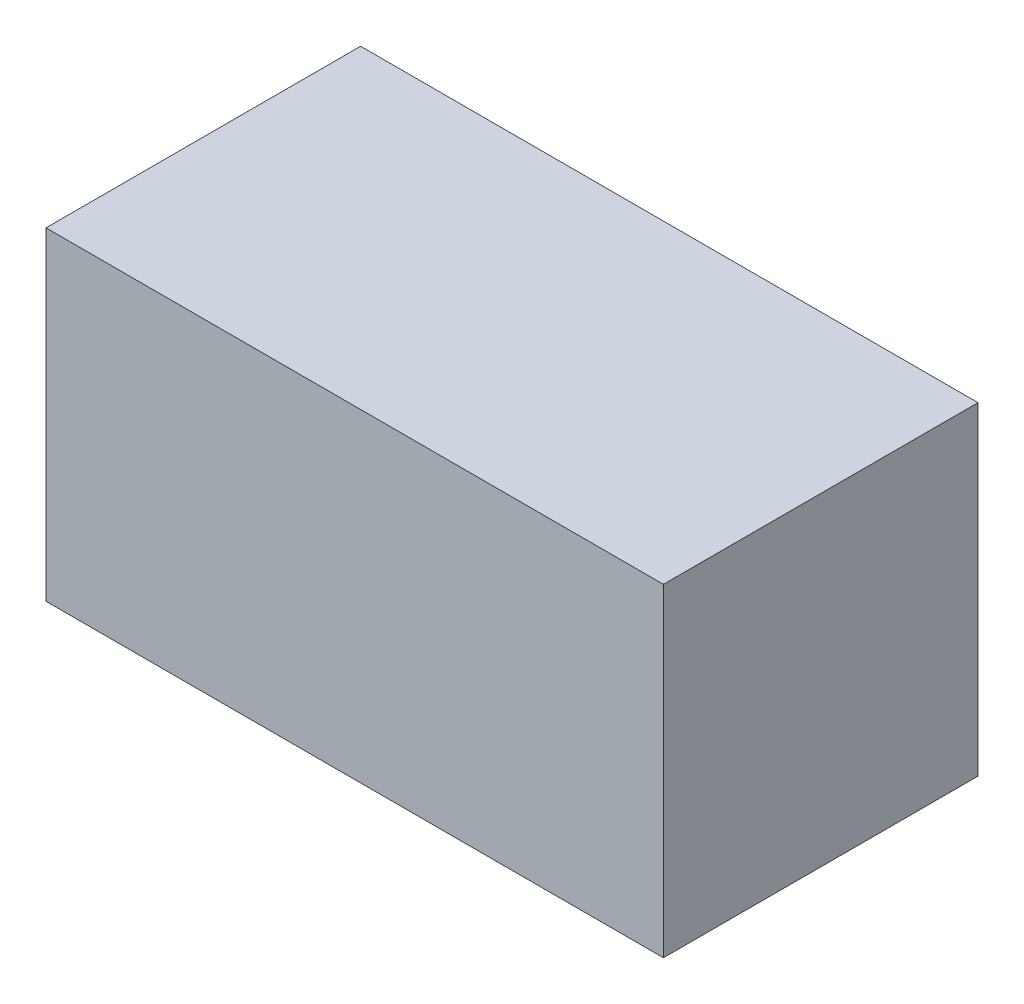
ISO-10303-21;
HEADER;
FILE_DESCRIPTION(('STEP AP214'),'2;1');
FILE_NAME('part.step','',(''),(''),'','','');
FILE_SCHEMA(('AUTOMOTIVE_DESIGN { 1 0 10303 214 1 1 1 1 }'));
ENDSEC;
DATA;
#1=APPLICATION_CONTEXT('core data for automotive mechanical design processes');
#2=APPLICATION_PROTOCOL_DEFINITION('international standard','automotive_design',2000,#1);
#3=PRODUCT_CONTEXT('',#1,'mechanical');
#4=PRODUCT('Part','Part','',(#3));
#5=PRODUCT_RELATED_PRODUCT_CATEGORY('part','',(#4));
#6=PRODUCT_DEFINITION_FORMATION('','',#4);
#7=PRODUCT_DEFINITION_CONTEXT('part definition',#1,'design');
#8=PRODUCT_DEFINITION('design','',#6,#7);
#9=PRODUCT_DEFINITION_SHAPE('','',#8);
#10=(LENGTH_UNIT() NAMED_UNIT(*) SI_UNIT(.MILLI.,.METRE.));
#11=(NAMED_UNIT(*) PLANE_ANGLE_UNIT() SI_UNIT($,.RADIAN.));
#12=(NAMED_UNIT(*) SI_UNIT($,.STERADIAN.) SOLID_ANGLE_UNIT());
#13=UNCERTAINTY_MEASURE_WITH_UNIT(LENGTH_MEASURE(1.E-05),#10,'distance_accuracy_value','');
#14=(GEOMETRIC_REPRESENTATION_CONTEXT(3) GLOBAL_UNCERTAINTY_ASSIGNED_CONTEXT((#13)) GLOBAL_UNIT_ASSIGNED_CONTEXT((#10,
#11,#12)) REPRESENTATION_CONTEXT('',''));
#15=CARTESIAN_POINT('',(0.,0.,0.));
#16=DIRECTION('',(0.,0.,1.));
#17=DIRECTION('',(1.,0.,0.));
#18=AXIS2_PLACEMENT_3D('',#15,#16,#17);
#19=CARTESIAN_POINT('',(-10.49999932,-5.49999916,10.69999892));
#20=DIRECTION('',(0.,0.,-1.));
#21=DIRECTION('',(-1.,0.,0.));
#22=AXIS2_PLACEMENT_3D('',#19,#20,#21);
#23=PLANE('',#22);
#24=DIRECTION('',(0.,1.,0.));
#25=VECTOR('',#24,1.);
#26=CARTESIAN_POINT('',(10.49999932,-5.49999916,10.69999892));
#27=LINE('',#26,#25);
#28=CARTESIAN_POINT('',(10.49999932,-5.49999916,10.69999892));
#29=VERTEX_POINT('',#28);
#30=CARTESIAN_POINT('',(10.49999932,5.49999916,10.69999892));
#31=VERTEX_POINT('',#30);
#32=EDGE_CURVE('E55',#29,#31,#27,.T.);
#33=ORIENTED_EDGE('',*,*,#32,.T.);
#34=DIRECTION('',(1.,0.,0.));
#35=VECTOR('',#34,1.);
#36=CARTESIAN_POINT('',(10.49999932,5.49999916,10.69999892));
#37=LINE('',#36,#35);
#38=CARTESIAN_POINT('',(-10.49999932,5.49999916,10.69999892));
#39=VERTEX_POINT('',#38);
#40=EDGE_CURVE('E57',#31,#39,#37,.F.);
#41=ORIENTED_EDGE('',*,*,#40,.T.);
#42=DIRECTION('',(0.,1.,0.));
#43=VECTOR('',#42,1.);
#44=CARTESIAN_POINT('',(-10.49999932,5.49999916,10.69999892));
#45=LINE('',#44,#43);
#46=CARTESIAN_POINT('',(-10.49999932,-5.49999916,10.69999892));
#47=VERTEX_POINT('',#46);
#48=EDGE_CURVE('E20',#39,#47,#45,.F.);
#49=ORIENTED_EDGE('',*,*,#48,.T.);
#50=DIRECTION('',(1.,0.,0.));
#51=VECTOR('',#50,1.);
#52=CARTESIAN_POINT('',(-10.49999932,-5.49999916,10.69999892));
#53=LINE('',#52,#51);
#54=EDGE_CURVE('E80',#47,#29,#53,.T.);
#55=ORIENTED_EDGE('',*,*,#54,.T.);
#56=EDGE_LOOP('',(#33,#41,#49,#55));
#57=FACE_BOUND('',#56,.T.);
#58=ADVANCED_FACE('F17',(#57),#23,.F.);
#59=CARTESIAN_POINT('',(-10.49999932,5.49999916,0.));
#60=DIRECTION('',(1.,0.,0.));
#61=DIRECTION('',(0.,0.,-1.));
#62=AXIS2_PLACEMENT_3D('',#59,#60,#61);
#63=PLANE('',#62);
#64=DIRECTION('',(0.,0.,1.));
#65=VECTOR('',#64,1.);
#66=CARTESIAN_POINT('',(-10.49999932,-5.49999916,0.));
#67=LINE('',#66,#65);
#68=CARTESIAN_POINT('',(-10.49999932,-5.49999916,0.));
#69=VERTEX_POINT('',#68);
#70=EDGE_CURVE('E68',#69,#47,#67,.T.);
#71=ORIENTED_EDGE('',*,*,#70,.T.);
#72=ORIENTED_EDGE('',*,*,#48,.F.);
#73=DIRECTION('',(0.,0.,-1.));
#74=VECTOR('',#73,1.);
#75=CARTESIAN_POINT('',(-10.49999932,5.49999916,0.));
#76=LINE('',#75,#74);
#77=CARTESIAN_POINT('',(-10.49999932,5.49999916,0.));
#78=VERTEX_POINT('',#77);
#79=EDGE_CURVE('E63',#39,#78,#76,.T.);
#80=ORIENTED_EDGE('',*,*,#79,.T.);
#81=DIRECTION('',(0.,1.,0.));
#82=VECTOR('',#81,1.);
#83=CARTESIAN_POINT('',(-10.49999932,-5.49999916,0.));
#84=LINE('',#83,#82);
#85=EDGE_CURVE('E83',#69,#78,#84,.T.);
#86=ORIENTED_EDGE('',*,*,#85,.F.);
#87=EDGE_LOOP('',(#71,#72,#80,#86));
#88=FACE_BOUND('',#87,.T.);
#89=ADVANCED_FACE('F65',(#88),#63,.F.);
#90=CARTESIAN_POINT('',(10.49999932,5.49999916,0.));
#91=DIRECTION('',(0.,-1.,0.));
#92=DIRECTION('',(0.,0.,-1.));
#93=AXIS2_PLACEMENT_3D('',#90,#91,#92);
#94=PLANE('',#93);
#95=ORIENTED_EDGE('',*,*,#79,.F.);
#96=ORIENTED_EDGE('',*,*,#40,.F.);
#97=DIRECTION('',(0.,0.,1.));
#98=VECTOR('',#97,1.);
#99=CARTESIAN_POINT('',(10.49999932,5.49999916,0.));
#100=LINE('',#99,#98);
#101=CARTESIAN_POINT('',(10.49999932,5.49999916,0.));
#102=VERTEX_POINT('',#101);
#103=EDGE_CURVE('E75',#31,#102,#100,.F.);
#104=ORIENTED_EDGE('',*,*,#103,.T.);
#105=DIRECTION('',(-1.,0.,0.));
#106=VECTOR('',#105,1.);
#107=CARTESIAN_POINT('',(-10.49999932,5.49999916,0.));
#108=LINE('',#107,#106);
#109=EDGE_CURVE('E72',#78,#102,#108,.F.);
#110=ORIENTED_EDGE('',*,*,#109,.F.);
#111=EDGE_LOOP('',(#95,#96,#104,#110));
#112=FACE_BOUND('',#111,.T.);
#113=ADVANCED_FACE('F70',(#112),#94,.F.);
#114=CARTESIAN_POINT('',(10.49999932,-5.49999916,0.));
#115=DIRECTION('',(-1.,0.,0.));
#116=DIRECTION('',(0.,0.,1.));
#117=AXIS2_PLACEMENT_3D('',#114,#115,#116);
#118=PLANE('',#117);
#119=ORIENTED_EDGE('',*,*,#103,.F.);
#120=ORIENTED_EDGE('',*,*,#32,.F.);
#121=DIRECTION('',(0.,0.,1.));
#122=VECTOR('',#121,1.);
#123=CARTESIAN_POINT('',(10.49999932,-5.49999916,0.));
#124=LINE('',#123,#122);
#125=CARTESIAN_POINT('',(10.49999932,-5.49999916,0.));
#126=VERTEX_POINT('',#125);
#127=EDGE_CURVE('E35',#29,#126,#124,.F.);
#128=ORIENTED_EDGE('',*,*,#127,.T.);
#129=DIRECTION('',(0.,1.,0.));
#130=VECTOR('',#129,1.);
#131=CARTESIAN_POINT('',(10.49999932,-5.49999916,0.));
#132=LINE('',#131,#130);
#133=EDGE_CURVE('E26',#102,#126,#132,.F.);
#134=ORIENTED_EDGE('',*,*,#133,.F.);
#135=EDGE_LOOP('',(#119,#120,#128,#134));
#136=FACE_BOUND('',#135,.T.);
#137=ADVANCED_FACE('F89',(#136),#118,.F.);
#138=CARTESIAN_POINT('',(-10.49999932,-5.49999916,0.));
#139=DIRECTION('',(0.,1.,0.));
#140=DIRECTION('',(0.,0.,1.));
#141=AXIS2_PLACEMENT_3D('',#138,#139,#140);
#142=PLANE('',#141);
#143=ORIENTED_EDGE('',*,*,#127,.F.);
#144=ORIENTED_EDGE('',*,*,#54,.F.);
#145=ORIENTED_EDGE('',*,*,#70,.F.);
#146=DIRECTION('',(-1.,0.,0.));
#147=VECTOR('',#146,1.);
#148=CARTESIAN_POINT('',(-10.49999932,-5.49999916,0.));
#149=LINE('',#148,#147);
#150=EDGE_CURVE('E11',#126,#69,#149,.T.);
#151=ORIENTED_EDGE('',*,*,#150,.F.);
#152=EDGE_LOOP('',(#143,#144,#145,#151));
#153=FACE_BOUND('',#152,.T.);
#154=ADVANCED_FACE('F91',(#153),#142,.F.);
#155=CARTESIAN_POINT('',(-10.49999932,-5.49999916,0.));
#156=DIRECTION('',(0.,0.,-1.));
#157=DIRECTION('',(-1.,0.,0.));
#158=AXIS2_PLACEMENT_3D('',#155,#156,#157);
#159=PLANE('',#158);
#160=ORIENTED_EDGE('',*,*,#133,.T.);
#161=ORIENTED_EDGE('',*,*,#150,.T.);
#162=ORIENTED_EDGE('',*,*,#85,.T.);
#163=ORIENTED_EDGE('',*,*,#109,.T.);
#164=EDGE_LOOP('',(#160,#161,#162,#163));
#165=FACE_BOUND('',#164,.T.);
#166=ADVANCED_FACE('F88',(#165),#159,.T.);
#167=CLOSED_SHELL('',(#58,#89,#113,#137,#154,#166));
#168=MANIFOLD_SOLID_BREP('B1',#167);
#169=ADVANCED_BREP_SHAPE_REPRESENTATION('',(#18,#168),#14);
#170=SHAPE_DEFINITION_REPRESENTATION(#9,#169);
ENDSEC;
END-ISO-10303-21;
